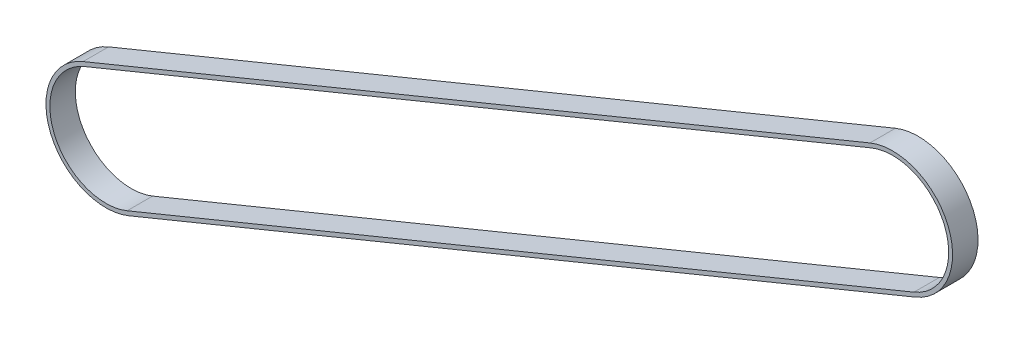
ISO-10303-21;
HEADER;
FILE_DESCRIPTION(('STEP AP214'),'2;1');
FILE_NAME('part.step','',(''),(''),'','','');
FILE_SCHEMA(('AUTOMOTIVE_DESIGN { 1 0 10303 214 1 1 1 1 }'));
ENDSEC;
DATA;
#1=APPLICATION_CONTEXT('core data for automotive mechanical design processes');
#2=APPLICATION_PROTOCOL_DEFINITION('international standard','automotive_design',2000,#1);
#3=PRODUCT_CONTEXT('',#1,'mechanical');
#4=PRODUCT('Part','Part','',(#3));
#5=PRODUCT_RELATED_PRODUCT_CATEGORY('part','',(#4));
#6=PRODUCT_DEFINITION_FORMATION('','',#4);
#7=PRODUCT_DEFINITION_CONTEXT('part definition',#1,'design');
#8=PRODUCT_DEFINITION('design','',#6,#7);
#9=PRODUCT_DEFINITION_SHAPE('','',#8);
#10=(LENGTH_UNIT() NAMED_UNIT(*) SI_UNIT(.MILLI.,.METRE.));
#11=(NAMED_UNIT(*) PLANE_ANGLE_UNIT() SI_UNIT($,.RADIAN.));
#12=(NAMED_UNIT(*) SI_UNIT($,.STERADIAN.) SOLID_ANGLE_UNIT());
#13=UNCERTAINTY_MEASURE_WITH_UNIT(LENGTH_MEASURE(1.E-05),#10,'distance_accuracy_value','');
#14=(GEOMETRIC_REPRESENTATION_CONTEXT(3) GLOBAL_UNCERTAINTY_ASSIGNED_CONTEXT((#13)) GLOBAL_UNIT_ASSIGNED_CONTEXT((#10,
#11,#12)) REPRESENTATION_CONTEXT('',''));
#15=CARTESIAN_POINT('',(0.,0.,0.));
#16=DIRECTION('',(0.,0.,1.));
#17=DIRECTION('',(1.,0.,0.));
#18=AXIS2_PLACEMENT_3D('',#15,#16,#17);
#19=CARTESIAN_POINT('',(-476.975044132624,-157.615589563328,0.));
#20=DIRECTION('',(-0.379682177787694,0.925116989288595,0.));
#21=DIRECTION('',(-0.925116989288595,-0.379682177787694,0.));
#22=AXIS2_PLACEMENT_3D('',#19,#20,#21);
#23=PLANE('',#22);
#24=DIRECTION('',(0.,0.,1.));
#25=VECTOR('',#24,1.);
#26=CARTESIAN_POINT('',(-476.975044132624,-157.615589563328,0.));
#27=LINE('',#26,#25);
#28=CARTESIAN_POINT('',(-476.975044132624,-157.615589563328,0.));
#29=VERTEX_POINT('',#28);
#30=CARTESIAN_POINT('',(-476.975044132624,-157.615589563328,15.));
#31=VERTEX_POINT('',#30);
#32=EDGE_CURVE('E124',#29,#31,#27,.T.);
#33=ORIENTED_EDGE('',*,*,#32,.T.);
#34=DIRECTION('',(0.925116989288595,0.379682177787694,0.));
#35=VECTOR('',#34,1.);
#36=CARTESIAN_POINT('',(-476.975044132624,-157.615589563328,15.));
#37=LINE('',#36,#35);
#38=CARTESIAN_POINT('',(-13.3969484176205,32.6439592220596,15.));
#39=VERTEX_POINT('',#38);
#40=EDGE_CURVE('E46',#31,#39,#37,.T.);
#41=ORIENTED_EDGE('',*,*,#40,.T.);
#42=CARTESIAN_POINT('',(-13.3969484176205,32.6439592220596,0.));
#43=DIRECTION('',(0.,0.,1.));
#44=VECTOR('',#43,1.);
#45=LINE('',#42,#44);
#46=CARTESIAN_POINT('',(-13.3969484176206,32.6439592220596,0.));
#47=VERTEX_POINT('',#46);
#48=EDGE_CURVE('E115',#47,#39,#45,.T.);
#49=ORIENTED_EDGE('',*,*,#48,.F.);
#50=DIRECTION('',(0.925116989288595,0.379682177787694,0.));
#51=VECTOR('',#50,1.);
#52=CARTESIAN_POINT('',(-476.975044132624,-157.615589563328,0.));
#53=LINE('',#52,#51);
#54=EDGE_CURVE('E11',#29,#47,#53,.T.);
#55=ORIENTED_EDGE('',*,*,#54,.F.);
#56=EDGE_LOOP('',(#33,#41,#49,#55));
#57=FACE_BOUND('',#56,.T.);
#58=ADVANCED_FACE('F35',(#57),#23,.T.);
#59=CARTESIAN_POINT('',(-476.107090674202,-159.730407000842,0.));
#60=DIRECTION('',(0.379682177787694,-0.925116989288595,0.));
#61=DIRECTION('',(0.925116989288595,0.379682177787694,0.));
#62=AXIS2_PLACEMENT_3D('',#59,#60,#61);
#63=PLANE('',#62);
#64=DIRECTION('',(0.,0.,-1.));
#65=VECTOR('',#64,1.);
#66=CARTESIAN_POINT('',(-476.107090674202,-159.730407000842,0.));
#67=LINE('',#66,#65);
#68=CARTESIAN_POINT('',(-476.107090674202,-159.730407000842,15.));
#69=VERTEX_POINT('',#68);
#70=CARTESIAN_POINT('',(-476.107090674202,-159.730407000842,0.));
#71=VERTEX_POINT('',#70);
#72=EDGE_CURVE('E216',#69,#71,#67,.T.);
#73=ORIENTED_EDGE('',*,*,#72,.T.);
#74=DIRECTION('',(0.925116989288595,0.379682177787694,0.));
#75=VECTOR('',#74,1.);
#76=CARTESIAN_POINT('',(-476.107090674202,-159.730407000842,0.));
#77=LINE('',#76,#75);
#78=CARTESIAN_POINT('',(-12.5289949591979,30.5291417845458,0.));
#79=VERTEX_POINT('',#78);
#80=EDGE_CURVE('E62',#71,#79,#77,.T.);
#81=ORIENTED_EDGE('',*,*,#80,.T.);
#82=CARTESIAN_POINT('',(-12.5289949591979,30.5291417845458,15.));
#83=DIRECTION('',(0.,0.,-1.));
#84=VECTOR('',#83,1.);
#85=LINE('',#82,#84);
#86=CARTESIAN_POINT('',(-12.5289949591979,30.5291417845458,15.));
#87=VERTEX_POINT('',#86);
#88=EDGE_CURVE('E120',#87,#79,#85,.T.);
#89=ORIENTED_EDGE('',*,*,#88,.F.);
#90=DIRECTION('',(0.925116989288595,0.379682177787694,0.));
#91=VECTOR('',#90,1.);
#92=CARTESIAN_POINT('',(-476.107090674202,-159.730407000842,15.));
#93=LINE('',#92,#91);
#94=EDGE_CURVE('E126',#69,#87,#93,.T.);
#95=ORIENTED_EDGE('',*,*,#94,.F.);
#96=EDGE_LOOP('',(#73,#81,#89,#95));
#97=FACE_BOUND('',#96,.T.);
#98=ADVANCED_FACE('F144',(#97),#63,.T.);
#99=CARTESIAN_POINT('',(-463.577578807208,-190.259267647366,0.));
#100=DIRECTION('',(0.,0.,-1.));
#101=DIRECTION('',(-1.,0.,0.));
#102=AXIS2_PLACEMENT_3D('',#99,#100,#101);
#103=CYLINDRICAL_SURFACE('',#102,35.286);
#104=DIRECTION('',(0.,0.,1.));
#105=VECTOR('',#104,1.);
#106=CARTESIAN_POINT('',(-450.180113481791,-222.902945731403,0.));
#107=LINE('',#106,#105);
#108=CARTESIAN_POINT('',(-450.180113481791,-222.902945731403,0.));
#109=VERTEX_POINT('',#108);
#110=CARTESIAN_POINT('',(-450.180113481791,-222.902945731403,15.));
#111=VERTEX_POINT('',#110);
#112=EDGE_CURVE('E227',#109,#111,#107,.T.);
#113=ORIENTED_EDGE('',*,*,#112,.T.);
#114=CARTESIAN_POINT('',(-463.577578807208,-190.259267647366,15.));
#115=DIRECTION('',(0.,0.,-1.));
#116=DIRECTION('',(-1.,0.,0.));
#117=AXIS2_PLACEMENT_3D('',#114,#115,#116);
#118=CIRCLE('',#117,35.286);
#119=EDGE_CURVE('E198',#111,#31,#118,.T.);
#120=ORIENTED_EDGE('',*,*,#119,.T.);
#121=ORIENTED_EDGE('',*,*,#32,.F.);
#122=CARTESIAN_POINT('',(-463.577578807208,-190.259267647366,0.));
#123=DIRECTION('',(0.,0.,-1.));
#124=DIRECTION('',(-1.,0.,0.));
#125=AXIS2_PLACEMENT_3D('',#122,#123,#124);
#126=CIRCLE('',#125,35.286);
#127=EDGE_CURVE('E196',#109,#29,#126,.T.);
#128=ORIENTED_EDGE('',*,*,#127,.F.);
#129=EDGE_LOOP('',(#113,#120,#121,#128));
#130=FACE_BOUND('',#129,.T.);
#131=ADVANCED_FACE('F153',(#130),#103,.T.);
#132=CARTESIAN_POINT('',(-463.577578807208,-190.259267647366,0.));
#133=DIRECTION('',(0.,0.,-1.));
#134=DIRECTION('',(-1.,0.,0.));
#135=AXIS2_PLACEMENT_3D('',#132,#133,#134);
#136=CYLINDRICAL_SURFACE('',#135,33.);
#137=DIRECTION('',(0.,0.,-1.));
#138=VECTOR('',#137,1.);
#139=CARTESIAN_POINT('',(-451.048066940214,-220.788128293889,0.));
#140=LINE('',#139,#138);
#141=CARTESIAN_POINT('',(-451.048066940214,-220.788128293889,15.));
#142=VERTEX_POINT('',#141);
#143=CARTESIAN_POINT('',(-451.048066940214,-220.788128293889,0.));
#144=VERTEX_POINT('',#143);
#145=EDGE_CURVE('E230',#142,#144,#140,.T.);
#146=ORIENTED_EDGE('',*,*,#145,.T.);
#147=CARTESIAN_POINT('',(-463.577578807208,-190.259267647366,0.));
#148=DIRECTION('',(0.,0.,-1.));
#149=DIRECTION('',(-1.,0.,0.));
#150=AXIS2_PLACEMENT_3D('',#147,#148,#149);
#151=CIRCLE('',#150,33.);
#152=EDGE_CURVE('E212',#144,#71,#151,.T.);
#153=ORIENTED_EDGE('',*,*,#152,.T.);
#154=ORIENTED_EDGE('',*,*,#72,.F.);
#155=CARTESIAN_POINT('',(-463.577578807208,-190.259267647366,15.));
#156=DIRECTION('',(0.,0.,-1.));
#157=DIRECTION('',(-1.,0.,0.));
#158=AXIS2_PLACEMENT_3D('',#155,#156,#157);
#159=CIRCLE('',#158,33.);
#160=EDGE_CURVE('E202',#142,#69,#159,.T.);
#161=ORIENTED_EDGE('',*,*,#160,.F.);
#162=EDGE_LOOP('',(#146,#153,#154,#161));
#163=FACE_BOUND('',#162,.T.);
#164=ADVANCED_FACE('F156',(#163),#136,.F.);
#165=CARTESIAN_POINT('',(13.3979822332126,-32.6433969460152,0.));
#166=DIRECTION('',(0.379682177787694,-0.925116989288595,0.));
#167=DIRECTION('',(0.925116989288595,0.379682177787694,0.));
#168=AXIS2_PLACEMENT_3D('',#165,#166,#167);
#169=PLANE('',#168);
#170=DIRECTION('',(0.,0.,1.));
#171=VECTOR('',#170,1.);
#172=CARTESIAN_POINT('',(13.3979822332126,-32.6433969460152,0.));
#173=LINE('',#172,#171);
#174=CARTESIAN_POINT('',(13.3979822332126,-32.6433969460152,0.));
#175=VERTEX_POINT('',#174);
#176=CARTESIAN_POINT('',(13.3979822332126,-32.6433969460152,15.));
#177=VERTEX_POINT('',#176);
#178=EDGE_CURVE('E236',#175,#177,#173,.T.);
#179=ORIENTED_EDGE('',*,*,#178,.T.);
#180=DIRECTION('',(-0.925116989288595,-0.379682177787694,0.));
#181=VECTOR('',#180,1.);
#182=CARTESIAN_POINT('',(13.3979822332126,-32.6433969460152,15.));
#183=LINE('',#182,#181);
#184=EDGE_CURVE('E111',#177,#111,#183,.T.);
#185=ORIENTED_EDGE('',*,*,#184,.T.);
#186=ORIENTED_EDGE('',*,*,#112,.F.);
#187=DIRECTION('',(-0.925116989288595,-0.379682177787694,0.));
#188=VECTOR('',#187,1.);
#189=CARTESIAN_POINT('',(13.3979822332126,-32.6433969460152,0.));
#190=LINE('',#189,#188);
#191=EDGE_CURVE('E218',#175,#109,#190,.T.);
#192=ORIENTED_EDGE('',*,*,#191,.F.);
#193=EDGE_LOOP('',(#179,#185,#186,#192));
#194=FACE_BOUND('',#193,.T.);
#195=ADVANCED_FACE('F160',(#194),#169,.T.);
#196=CARTESIAN_POINT('',(12.5300287747899,-30.5285795085014,0.));
#197=DIRECTION('',(-0.379682177787694,0.925116989288595,0.));
#198=DIRECTION('',(-0.925116989288595,-0.379682177787694,0.));
#199=AXIS2_PLACEMENT_3D('',#196,#197,#198);
#200=PLANE('',#199);
#201=DIRECTION('',(0.,0.,-1.));
#202=VECTOR('',#201,1.);
#203=CARTESIAN_POINT('',(12.5300287747899,-30.5285795085014,0.));
#204=LINE('',#203,#202);
#205=CARTESIAN_POINT('',(12.5300287747899,-30.5285795085014,15.));
#206=VERTEX_POINT('',#205);
#207=CARTESIAN_POINT('',(12.5300287747899,-30.5285795085014,0.));
#208=VERTEX_POINT('',#207);
#209=EDGE_CURVE('E233',#206,#208,#204,.T.);
#210=ORIENTED_EDGE('',*,*,#209,.T.);
#211=DIRECTION('',(-0.925116989288595,-0.379682177787694,0.));
#212=VECTOR('',#211,1.);
#213=CARTESIAN_POINT('',(12.5300287747899,-30.5285795085014,0.));
#214=LINE('',#213,#212);
#215=EDGE_CURVE('E224',#208,#144,#214,.T.);
#216=ORIENTED_EDGE('',*,*,#215,.T.);
#217=ORIENTED_EDGE('',*,*,#145,.F.);
#218=DIRECTION('',(-0.925116989288595,-0.379682177787694,0.));
#219=VECTOR('',#218,1.);
#220=CARTESIAN_POINT('',(12.5300287747899,-30.5285795085014,15.));
#221=LINE('',#220,#219);
#222=EDGE_CURVE('E221',#206,#142,#221,.T.);
#223=ORIENTED_EDGE('',*,*,#222,.F.);
#224=EDGE_LOOP('',(#210,#216,#217,#223));
#225=FACE_BOUND('',#224,.T.);
#226=ADVANCED_FACE('F164',(#225),#200,.T.);
#227=CARTESIAN_POINT('',(12.5300287747899,-30.5285795085014,0.));
#228=DIRECTION('',(0.,0.,1.));
#229=DIRECTION('',(1.,0.,0.));
#230=AXIS2_PLACEMENT_3D('',#227,#228,#229);
#231=PLANE('',#230);
#232=CARTESIAN_POINT('',(0.00051690779601099,0.000281138022195648,0.));
#233=DIRECTION('',(0.,0.,1.));
#234=DIRECTION('',(1.,0.,0.));
#235=AXIS2_PLACEMENT_3D('',#232,#233,#234);
#236=CIRCLE('',#235,35.286);
#237=EDGE_CURVE('E54',#175,#47,#236,.T.);
#238=ORIENTED_EDGE('',*,*,#237,.F.);
#239=ORIENTED_EDGE('',*,*,#191,.T.);
#240=ORIENTED_EDGE('',*,*,#127,.T.);
#241=ORIENTED_EDGE('',*,*,#54,.T.);
#242=EDGE_LOOP('',(#238,#239,#240,#241));
#243=FACE_BOUND('',#242,.T.);
#244=CARTESIAN_POINT('',(0.00051690779601099,0.000281138022195648,0.));
#245=DIRECTION('',(0.,0.,1.));
#246=DIRECTION('',(1.,0.,0.));
#247=AXIS2_PLACEMENT_3D('',#244,#245,#246);
#248=CIRCLE('',#247,33.);
#249=EDGE_CURVE('E191',#208,#79,#248,.T.);
#250=ORIENTED_EDGE('',*,*,#249,.T.);
#251=ORIENTED_EDGE('',*,*,#80,.F.);
#252=ORIENTED_EDGE('',*,*,#152,.F.);
#253=ORIENTED_EDGE('',*,*,#215,.F.);
#254=EDGE_LOOP('',(#250,#251,#252,#253));
#255=FACE_BOUND('',#254,.T.);
#256=ADVANCED_FACE('F167',(#243,#255),#231,.F.);
#257=CARTESIAN_POINT('',(0.00051690779601099,0.000281138022195648,0.));
#258=DIRECTION('',(0.,0.,1.));
#259=DIRECTION('',(1.,0.,0.));
#260=AXIS2_PLACEMENT_3D('',#257,#258,#259);
#261=CYLINDRICAL_SURFACE('',#260,33.);
#262=CARTESIAN_POINT('',(0.00051690779601099,0.000281138022195648,15.));
#263=DIRECTION('',(0.,0.,1.));
#264=DIRECTION('',(1.,0.,0.));
#265=AXIS2_PLACEMENT_3D('',#262,#263,#264);
#266=CIRCLE('',#265,33.);
#267=EDGE_CURVE('E113',#206,#87,#266,.T.);
#268=ORIENTED_EDGE('',*,*,#267,.T.);
#269=ORIENTED_EDGE('',*,*,#88,.T.);
#270=ORIENTED_EDGE('',*,*,#249,.F.);
#271=ORIENTED_EDGE('',*,*,#209,.F.);
#272=EDGE_LOOP('',(#268,#269,#270,#271));
#273=FACE_BOUND('',#272,.T.);
#274=ADVANCED_FACE('F169',(#273),#261,.F.);
#275=CARTESIAN_POINT('',(12.5300287747899,-30.5285795085014,15.));
#276=DIRECTION('',(0.,0.,-1.));
#277=DIRECTION('',(-1.,0.,0.));
#278=AXIS2_PLACEMENT_3D('',#275,#276,#277);
#279=PLANE('',#278);
#280=ORIENTED_EDGE('',*,*,#267,.F.);
#281=ORIENTED_EDGE('',*,*,#222,.T.);
#282=ORIENTED_EDGE('',*,*,#160,.T.);
#283=ORIENTED_EDGE('',*,*,#94,.T.);
#284=EDGE_LOOP('',(#280,#281,#282,#283));
#285=FACE_BOUND('',#284,.T.);
#286=CARTESIAN_POINT('',(0.00051690779601099,0.000281138022195648,15.));
#287=DIRECTION('',(0.,0.,1.));
#288=DIRECTION('',(1.,0.,0.));
#289=AXIS2_PLACEMENT_3D('',#286,#287,#288);
#290=CIRCLE('',#289,35.286);
#291=EDGE_CURVE('E106',#177,#39,#290,.T.);
#292=ORIENTED_EDGE('',*,*,#291,.T.);
#293=ORIENTED_EDGE('',*,*,#40,.F.);
#294=ORIENTED_EDGE('',*,*,#119,.F.);
#295=ORIENTED_EDGE('',*,*,#184,.F.);
#296=EDGE_LOOP('',(#292,#293,#294,#295));
#297=FACE_BOUND('',#296,.T.);
#298=ADVANCED_FACE('F107',(#285,#297),#279,.F.);
#299=CARTESIAN_POINT('',(0.00051690779601099,0.000281138022195648,0.));
#300=DIRECTION('',(0.,0.,1.));
#301=DIRECTION('',(1.,0.,0.));
#302=AXIS2_PLACEMENT_3D('',#299,#300,#301);
#303=CYLINDRICAL_SURFACE('',#302,35.286);
#304=ORIENTED_EDGE('',*,*,#178,.F.);
#305=ORIENTED_EDGE('',*,*,#237,.T.);
#306=ORIENTED_EDGE('',*,*,#48,.T.);
#307=ORIENTED_EDGE('',*,*,#291,.F.);
#308=EDGE_LOOP('',(#304,#305,#306,#307));
#309=FACE_BOUND('',#308,.T.);
#310=ADVANCED_FACE('F117',(#309),#303,.T.);
#311=CLOSED_SHELL('',(#58,#98,#131,#164,#195,#226,#256,#274,#298,#310));
#312=MANIFOLD_SOLID_BREP('B2',#311);
#313=ADVANCED_BREP_SHAPE_REPRESENTATION('',(#18,#312),#14);
#314=SHAPE_DEFINITION_REPRESENTATION(#9,#313);
ENDSEC;
END-ISO-10303-21;
